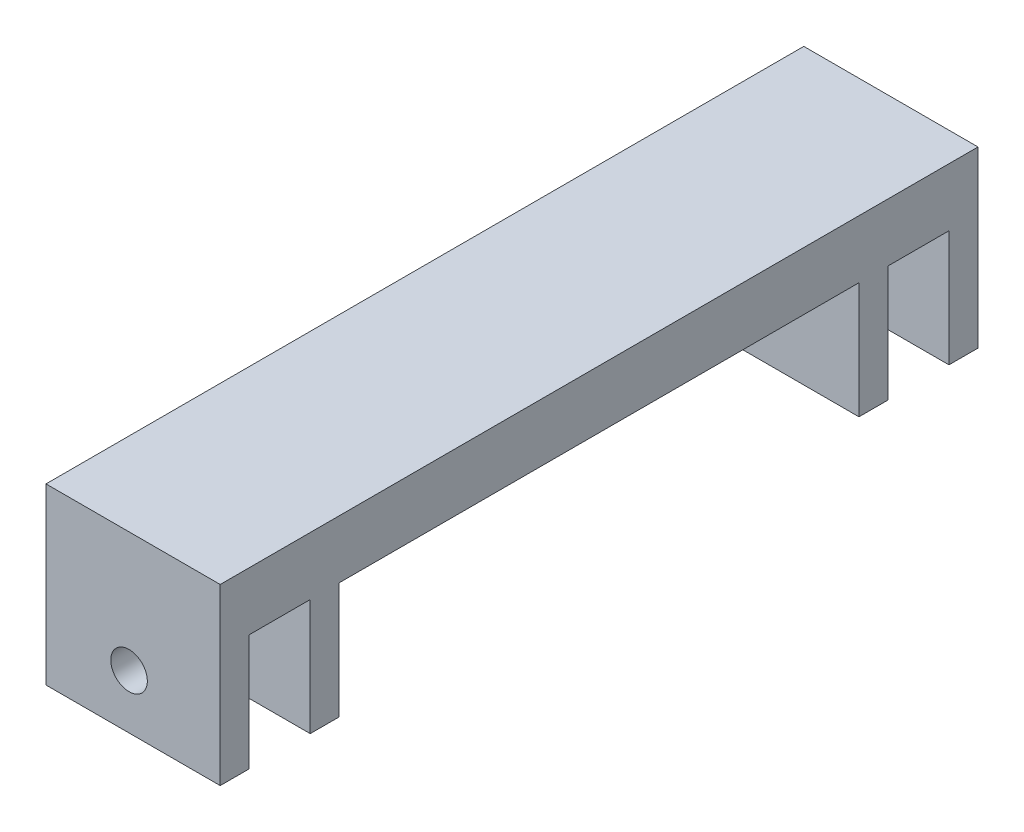
ISO-10303-21;
HEADER;
FILE_DESCRIPTION(('STEP AP214'),'2;1');
FILE_NAME('part.step','',(''),(''),'','','');
FILE_SCHEMA(('AUTOMOTIVE_DESIGN { 1 0 10303 214 1 1 1 1 }'));
ENDSEC;
DATA;
#1=APPLICATION_CONTEXT('core data for automotive mechanical design processes');
#2=APPLICATION_PROTOCOL_DEFINITION('international standard','automotive_design',2000,#1);
#3=PRODUCT_CONTEXT('',#1,'mechanical');
#4=PRODUCT('Part','Part','',(#3));
#5=PRODUCT_RELATED_PRODUCT_CATEGORY('part','',(#4));
#6=PRODUCT_DEFINITION_FORMATION('','',#4);
#7=PRODUCT_DEFINITION_CONTEXT('part definition',#1,'design');
#8=PRODUCT_DEFINITION('design','',#6,#7);
#9=PRODUCT_DEFINITION_SHAPE('','',#8);
#10=(LENGTH_UNIT() NAMED_UNIT(*) SI_UNIT(.MILLI.,.METRE.));
#11=(NAMED_UNIT(*) PLANE_ANGLE_UNIT() SI_UNIT($,.RADIAN.));
#12=(NAMED_UNIT(*) SI_UNIT($,.STERADIAN.) SOLID_ANGLE_UNIT());
#13=UNCERTAINTY_MEASURE_WITH_UNIT(LENGTH_MEASURE(1.E-05),#10,'distance_accuracy_value','');
#14=(GEOMETRIC_REPRESENTATION_CONTEXT(3) GLOBAL_UNCERTAINTY_ASSIGNED_CONTEXT((#13)) GLOBAL_UNIT_ASSIGNED_CONTEXT((#10,
#11,#12)) REPRESENTATION_CONTEXT('',''));
#15=CARTESIAN_POINT('',(0.,0.,0.));
#16=DIRECTION('',(0.,0.,1.));
#17=DIRECTION('',(1.,0.,0.));
#18=AXIS2_PLACEMENT_3D('',#15,#16,#17);
#19=CARTESIAN_POINT('',(0.,0.,130.5));
#20=DIRECTION('',(0.,1.,0.));
#21=DIRECTION('',(0.,0.,1.));
#22=AXIS2_PLACEMENT_3D('',#19,#20,#21);
#23=PLANE('',#22);
#24=DIRECTION('',(-1.,0.,0.));
#25=VECTOR('',#24,1.);
#26=CARTESIAN_POINT('',(30.,0.,115.));
#27=LINE('',#26,#25);
#28=CARTESIAN_POINT('',(30.,0.,115.));
#29=VERTEX_POINT('',#28);
#30=CARTESIAN_POINT('',(0.,0.,115.));
#31=VERTEX_POINT('',#30);
#32=EDGE_CURVE('E297',#29,#31,#27,.T.);
#33=ORIENTED_EDGE('',*,*,#32,.F.);
#34=DIRECTION('',(0.,0.,-1.));
#35=VECTOR('',#34,1.);
#36=CARTESIAN_POINT('',(30.,0.,130.5));
#37=LINE('',#36,#35);
#38=CARTESIAN_POINT('',(30.,0.,125.5));
#39=VERTEX_POINT('',#38);
#40=EDGE_CURVE('E172',#39,#29,#37,.T.);
#41=ORIENTED_EDGE('',*,*,#40,.F.);
#42=DIRECTION('',(1.,0.,0.));
#43=VECTOR('',#42,1.);
#44=CARTESIAN_POINT('',(0.,0.,125.5));
#45=LINE('',#44,#43);
#46=CARTESIAN_POINT('',(0.,0.,125.5));
#47=VERTEX_POINT('',#46);
#48=EDGE_CURVE('E173',#47,#39,#45,.T.);
#49=ORIENTED_EDGE('',*,*,#48,.F.);
#50=DIRECTION('',(0.,0.,-1.));
#51=VECTOR('',#50,1.);
#52=CARTESIAN_POINT('',(0.,0.,130.5));
#53=LINE('',#52,#51);
#54=EDGE_CURVE('E11',#47,#31,#53,.T.);
#55=ORIENTED_EDGE('',*,*,#54,.T.);
#56=EDGE_LOOP('',(#33,#41,#49,#55));
#57=FACE_BOUND('',#56,.T.);
#58=ADVANCED_FACE('F35',(#57),#23,.F.);
#59=DIRECTION('',(1.,0.,0.));
#60=VECTOR('',#59,1.);
#61=CARTESIAN_POINT('',(30.,0.,110.));
#62=LINE('',#61,#60);
#63=CARTESIAN_POINT('',(0.,0.,110.));
#64=VERTEX_POINT('',#63);
#65=CARTESIAN_POINT('',(30.,0.,110.));
#66=VERTEX_POINT('',#65);
#67=EDGE_CURVE('E166',#64,#66,#62,.T.);
#68=ORIENTED_EDGE('',*,*,#67,.F.);
#69=CARTESIAN_POINT('',(0.,0.,20.5));
#70=VERTEX_POINT('',#69);
#71=EDGE_CURVE('E44',#64,#70,#53,.T.);
#72=ORIENTED_EDGE('',*,*,#71,.T.);
#73=DIRECTION('',(-1.,0.,0.));
#74=VECTOR('',#73,1.);
#75=CARTESIAN_POINT('',(30.,0.,20.5));
#76=LINE('',#75,#74);
#77=CARTESIAN_POINT('',(30.,0.,20.5));
#78=VERTEX_POINT('',#77);
#79=EDGE_CURVE('E195',#78,#70,#76,.T.);
#80=ORIENTED_EDGE('',*,*,#79,.F.);
#81=EDGE_CURVE('E256',#66,#78,#37,.T.);
#82=ORIENTED_EDGE('',*,*,#81,.F.);
#83=EDGE_LOOP('',(#68,#72,#80,#82));
#84=FACE_BOUND('',#83,.T.);
#85=ADVANCED_FACE('F314',(#84),#23,.F.);
#86=DIRECTION('',(1.,0.,0.));
#87=VECTOR('',#86,1.);
#88=CARTESIAN_POINT('',(30.,0.,15.5));
#89=LINE('',#88,#87);
#90=CARTESIAN_POINT('',(0.,0.,15.5));
#91=VERTEX_POINT('',#90);
#92=CARTESIAN_POINT('',(30.,0.,15.5));
#93=VERTEX_POINT('',#92);
#94=EDGE_CURVE('E200',#91,#93,#89,.T.);
#95=ORIENTED_EDGE('',*,*,#94,.F.);
#96=CARTESIAN_POINT('',(0.,0.,5.));
#97=VERTEX_POINT('',#96);
#98=EDGE_CURVE('E45',#91,#97,#53,.T.);
#99=ORIENTED_EDGE('',*,*,#98,.T.);
#100=DIRECTION('',(-1.,0.,0.));
#101=VECTOR('',#100,1.);
#102=CARTESIAN_POINT('',(0.,0.,5.));
#103=LINE('',#102,#101);
#104=CARTESIAN_POINT('',(30.,0.,5.));
#105=VERTEX_POINT('',#104);
#106=EDGE_CURVE('E218',#105,#97,#103,.T.);
#107=ORIENTED_EDGE('',*,*,#106,.F.);
#108=EDGE_CURVE('E255',#93,#105,#37,.T.);
#109=ORIENTED_EDGE('',*,*,#108,.F.);
#110=EDGE_LOOP('',(#95,#99,#107,#109));
#111=FACE_BOUND('',#110,.T.);
#112=ADVANCED_FACE('F264',(#111),#23,.F.);
#113=CARTESIAN_POINT('',(0.,0.,130.5));
#114=DIRECTION('',(1.,0.,0.));
#115=DIRECTION('',(0.,0.,-1.));
#116=AXIS2_PLACEMENT_3D('',#113,#114,#115);
#117=PLANE('',#116);
#118=DIRECTION('',(0.,-1.,0.));
#119=VECTOR('',#118,1.);
#120=CARTESIAN_POINT('',(0.,0.,0.));
#121=LINE('',#120,#119);
#122=CARTESIAN_POINT('',(0.,10.,0.));
#123=VERTEX_POINT('',#122);
#124=CARTESIAN_POINT('',(0.,-20.,0.));
#125=VERTEX_POINT('',#124);
#126=EDGE_CURVE('E237',#123,#125,#121,.T.);
#127=ORIENTED_EDGE('',*,*,#126,.T.);
#128=DIRECTION('',(0.,0.,-1.));
#129=VECTOR('',#128,1.);
#130=CARTESIAN_POINT('',(0.,-20.,0.));
#131=LINE('',#130,#129);
#132=CARTESIAN_POINT('',(0.,-20.,5.));
#133=VERTEX_POINT('',#132);
#134=EDGE_CURVE('E219',#133,#125,#131,.T.);
#135=ORIENTED_EDGE('',*,*,#134,.F.);
#136=DIRECTION('',(0.,1.,0.));
#137=VECTOR('',#136,1.);
#138=CARTESIAN_POINT('',(0.,-20.,5.));
#139=LINE('',#138,#137);
#140=EDGE_CURVE('E229',#133,#97,#139,.T.);
#141=ORIENTED_EDGE('',*,*,#140,.T.);
#142=ORIENTED_EDGE('',*,*,#98,.F.);
#143=DIRECTION('',(0.,1.,0.));
#144=VECTOR('',#143,1.);
#145=CARTESIAN_POINT('',(0.,-20.,15.5));
#146=LINE('',#145,#144);
#147=CARTESIAN_POINT('',(0.,-20.,15.5));
#148=VERTEX_POINT('',#147);
#149=EDGE_CURVE('E210',#148,#91,#146,.T.);
#150=ORIENTED_EDGE('',*,*,#149,.F.);
#151=DIRECTION('',(0.,0.,-1.));
#152=VECTOR('',#151,1.);
#153=CARTESIAN_POINT('',(0.,-20.,15.5));
#154=LINE('',#153,#152);
#155=CARTESIAN_POINT('',(0.,-20.,20.5));
#156=VERTEX_POINT('',#155);
#157=EDGE_CURVE('E202',#156,#148,#154,.T.);
#158=ORIENTED_EDGE('',*,*,#157,.F.);
#159=DIRECTION('',(0.,1.,0.));
#160=VECTOR('',#159,1.);
#161=CARTESIAN_POINT('',(0.,-20.,20.5));
#162=LINE('',#161,#160);
#163=EDGE_CURVE('E212',#156,#70,#162,.T.);
#164=ORIENTED_EDGE('',*,*,#163,.T.);
#165=ORIENTED_EDGE('',*,*,#71,.F.);
#166=DIRECTION('',(0.,1.,0.));
#167=VECTOR('',#166,1.);
#168=CARTESIAN_POINT('',(0.,-20.,110.));
#169=LINE('',#168,#167);
#170=CARTESIAN_POINT('',(0.,-20.,110.));
#171=VERTEX_POINT('',#170);
#172=EDGE_CURVE('E177',#171,#64,#169,.T.);
#173=ORIENTED_EDGE('',*,*,#172,.F.);
#174=DIRECTION('',(0.,0.,-1.));
#175=VECTOR('',#174,1.);
#176=CARTESIAN_POINT('',(0.,-20.,115.));
#177=LINE('',#176,#175);
#178=CARTESIAN_POINT('',(0.,-20.,115.));
#179=VERTEX_POINT('',#178);
#180=EDGE_CURVE('E160',#179,#171,#177,.T.);
#181=ORIENTED_EDGE('',*,*,#180,.F.);
#182=DIRECTION('',(0.,1.,0.));
#183=VECTOR('',#182,1.);
#184=CARTESIAN_POINT('',(0.,-20.,115.));
#185=LINE('',#184,#183);
#186=EDGE_CURVE('E157',#179,#31,#185,.T.);
#187=ORIENTED_EDGE('',*,*,#186,.T.);
#188=ORIENTED_EDGE('',*,*,#54,.F.);
#189=DIRECTION('',(0.,1.,0.));
#190=VECTOR('',#189,1.);
#191=CARTESIAN_POINT('',(0.,-20.,125.5));
#192=LINE('',#191,#190);
#193=CARTESIAN_POINT('',(0.,-20.,125.5));
#194=VERTEX_POINT('',#193);
#195=EDGE_CURVE('E193',#194,#47,#192,.T.);
#196=ORIENTED_EDGE('',*,*,#195,.F.);
#197=DIRECTION('',(0.,0.,-1.));
#198=VECTOR('',#197,1.);
#199=CARTESIAN_POINT('',(0.,-20.,130.5));
#200=LINE('',#199,#198);
#201=CARTESIAN_POINT('',(0.,-20.,130.5));
#202=VERTEX_POINT('',#201);
#203=EDGE_CURVE('E175',#202,#194,#200,.T.);
#204=ORIENTED_EDGE('',*,*,#203,.F.);
#205=DIRECTION('',(0.,-1.,0.));
#206=VECTOR('',#205,1.);
#207=CARTESIAN_POINT('',(0.,0.,130.5));
#208=LINE('',#207,#206);
#209=CARTESIAN_POINT('',(0.,10.,130.5));
#210=VERTEX_POINT('',#209);
#211=EDGE_CURVE('E238',#210,#202,#208,.T.);
#212=ORIENTED_EDGE('',*,*,#211,.F.);
#213=DIRECTION('',(0.,0.,-1.));
#214=VECTOR('',#213,1.);
#215=CARTESIAN_POINT('',(0.,10.,130.5));
#216=LINE('',#215,#214);
#217=EDGE_CURVE('E245',#210,#123,#216,.T.);
#218=ORIENTED_EDGE('',*,*,#217,.T.);
#219=EDGE_LOOP('',(#127,#135,#141,#142,#150,#158,#164,#165,#173,#181,#187,#188,#196,#204,#212,#218));
#220=FACE_BOUND('',#219,.T.);
#221=ADVANCED_FACE('F37',(#220),#117,.F.);
#222=CARTESIAN_POINT('',(30.,0.,130.5));
#223=DIRECTION('',(-1.,0.,0.));
#224=DIRECTION('',(0.,0.,1.));
#225=AXIS2_PLACEMENT_3D('',#222,#223,#224);
#226=PLANE('',#225);
#227=DIRECTION('',(0.,1.,0.));
#228=VECTOR('',#227,1.);
#229=CARTESIAN_POINT('',(30.,0.,0.));
#230=LINE('',#229,#228);
#231=CARTESIAN_POINT('',(30.,-20.,0.));
#232=VERTEX_POINT('',#231);
#233=CARTESIAN_POINT('',(30.,10.,0.));
#234=VERTEX_POINT('',#233);
#235=EDGE_CURVE('E247',#232,#234,#230,.T.);
#236=ORIENTED_EDGE('',*,*,#235,.T.);
#237=DIRECTION('',(0.,0.,-1.));
#238=VECTOR('',#237,1.);
#239=CARTESIAN_POINT('',(30.,10.,130.5));
#240=LINE('',#239,#238);
#241=CARTESIAN_POINT('',(30.,10.,130.5));
#242=VERTEX_POINT('',#241);
#243=EDGE_CURVE('E252',#242,#234,#240,.T.);
#244=ORIENTED_EDGE('',*,*,#243,.F.);
#245=DIRECTION('',(0.,1.,0.));
#246=VECTOR('',#245,1.);
#247=CARTESIAN_POINT('',(30.,0.,130.5));
#248=LINE('',#247,#246);
#249=CARTESIAN_POINT('',(30.,-20.,130.5));
#250=VERTEX_POINT('',#249);
#251=EDGE_CURVE('E240',#250,#242,#248,.T.);
#252=ORIENTED_EDGE('',*,*,#251,.F.);
#253=DIRECTION('',(0.,0.,1.));
#254=VECTOR('',#253,1.);
#255=CARTESIAN_POINT('',(30.,-20.,130.5));
#256=LINE('',#255,#254);
#257=CARTESIAN_POINT('',(30.,-20.,125.5));
#258=VERTEX_POINT('',#257);
#259=EDGE_CURVE('E185',#258,#250,#256,.T.);
#260=ORIENTED_EDGE('',*,*,#259,.F.);
#261=DIRECTION('',(0.,1.,0.));
#262=VECTOR('',#261,1.);
#263=CARTESIAN_POINT('',(30.,-20.,125.5));
#264=LINE('',#263,#262);
#265=EDGE_CURVE('E190',#258,#39,#264,.T.);
#266=ORIENTED_EDGE('',*,*,#265,.T.);
#267=ORIENTED_EDGE('',*,*,#40,.T.);
#268=DIRECTION('',(0.,1.,0.));
#269=VECTOR('',#268,1.);
#270=CARTESIAN_POINT('',(30.,-20.,115.));
#271=LINE('',#270,#269);
#272=CARTESIAN_POINT('',(30.,-20.,115.));
#273=VERTEX_POINT('',#272);
#274=EDGE_CURVE('E154',#273,#29,#271,.T.);
#275=ORIENTED_EDGE('',*,*,#274,.F.);
#276=DIRECTION('',(0.,0.,1.));
#277=VECTOR('',#276,1.);
#278=CARTESIAN_POINT('',(30.,-20.,115.));
#279=LINE('',#278,#277);
#280=CARTESIAN_POINT('',(30.,-20.,110.));
#281=VERTEX_POINT('',#280);
#282=EDGE_CURVE('E161',#281,#273,#279,.T.);
#283=ORIENTED_EDGE('',*,*,#282,.F.);
#284=DIRECTION('',(0.,1.,0.));
#285=VECTOR('',#284,1.);
#286=CARTESIAN_POINT('',(30.,-20.,110.));
#287=LINE('',#286,#285);
#288=EDGE_CURVE('E52',#281,#66,#287,.T.);
#289=ORIENTED_EDGE('',*,*,#288,.T.);
#290=ORIENTED_EDGE('',*,*,#81,.T.);
#291=DIRECTION('',(0.,1.,0.));
#292=VECTOR('',#291,1.);
#293=CARTESIAN_POINT('',(30.,-20.,20.5));
#294=LINE('',#293,#292);
#295=CARTESIAN_POINT('',(30.,-20.,20.5));
#296=VERTEX_POINT('',#295);
#297=EDGE_CURVE('E215',#296,#78,#294,.T.);
#298=ORIENTED_EDGE('',*,*,#297,.F.);
#299=DIRECTION('',(0.,0.,1.));
#300=VECTOR('',#299,1.);
#301=CARTESIAN_POINT('',(30.,-20.,15.5));
#302=LINE('',#301,#300);
#303=CARTESIAN_POINT('',(30.,-20.,15.5));
#304=VERTEX_POINT('',#303);
#305=EDGE_CURVE('E196',#304,#296,#302,.T.);
#306=ORIENTED_EDGE('',*,*,#305,.F.);
#307=DIRECTION('',(0.,1.,0.));
#308=VECTOR('',#307,1.);
#309=CARTESIAN_POINT('',(30.,-20.,15.5));
#310=LINE('',#309,#308);
#311=EDGE_CURVE('E59',#304,#93,#310,.T.);
#312=ORIENTED_EDGE('',*,*,#311,.T.);
#313=ORIENTED_EDGE('',*,*,#108,.T.);
#314=DIRECTION('',(0.,1.,0.));
#315=VECTOR('',#314,1.);
#316=CARTESIAN_POINT('',(30.,-20.,5.));
#317=LINE('',#316,#315);
#318=CARTESIAN_POINT('',(30.,-20.,5.));
#319=VERTEX_POINT('',#318);
#320=EDGE_CURVE('E234',#319,#105,#317,.T.);
#321=ORIENTED_EDGE('',*,*,#320,.F.);
#322=DIRECTION('',(0.,0.,1.));
#323=VECTOR('',#322,1.);
#324=CARTESIAN_POINT('',(30.,-20.,0.));
#325=LINE('',#324,#323);
#326=EDGE_CURVE('E225',#232,#319,#325,.T.);
#327=ORIENTED_EDGE('',*,*,#326,.F.);
#328=EDGE_LOOP('',(#236,#244,#252,#260,#266,#267,#275,#283,#289,#290,#298,#306,#312,#313,#321,#327));
#329=FACE_BOUND('',#328,.T.);
#330=ADVANCED_FACE('F169',(#329),#226,.F.);
#331=CARTESIAN_POINT('',(0.,10.,130.5));
#332=DIRECTION('',(0.,-1.,0.));
#333=DIRECTION('',(0.,0.,-1.));
#334=AXIS2_PLACEMENT_3D('',#331,#332,#333);
#335=PLANE('',#334);
#336=DIRECTION('',(-1.,0.,0.));
#337=VECTOR('',#336,1.);
#338=CARTESIAN_POINT('',(0.,10.,0.));
#339=LINE('',#338,#337);
#340=EDGE_CURVE('E241',#234,#123,#339,.T.);
#341=ORIENTED_EDGE('',*,*,#340,.T.);
#342=ORIENTED_EDGE('',*,*,#217,.F.);
#343=DIRECTION('',(-1.,0.,0.));
#344=VECTOR('',#343,1.);
#345=CARTESIAN_POINT('',(0.,10.,130.5));
#346=LINE('',#345,#344);
#347=EDGE_CURVE('E243',#242,#210,#346,.T.);
#348=ORIENTED_EDGE('',*,*,#347,.F.);
#349=ORIENTED_EDGE('',*,*,#243,.T.);
#350=EDGE_LOOP('',(#341,#342,#348,#349));
#351=FACE_BOUND('',#350,.T.);
#352=ADVANCED_FACE('F278',(#351),#335,.F.);
#353=CARTESIAN_POINT('',(0.,0.,130.5));
#354=DIRECTION('',(0.,0.,-1.));
#355=DIRECTION('',(-1.,0.,0.));
#356=AXIS2_PLACEMENT_3D('',#353,#354,#355);
#357=PLANE('',#356);
#358=CARTESIAN_POINT('',(14.3021431152746,-10.6869098112044,130.5));
#359=DIRECTION('',(0.,0.,1.));
#360=DIRECTION('',(1.,0.,0.));
#361=AXIS2_PLACEMENT_3D('',#358,#359,#360);
#362=CIRCLE('',#361,3.15);
#363=CARTESIAN_POINT('',(17.4521431152746,-10.6869098112044,130.5));
#364=VERTEX_POINT('',#363);
#365=EDGE_CURVE('E549',#364,#364,#362,.T.);
#366=ORIENTED_EDGE('',*,*,#365,.F.);
#367=EDGE_LOOP('',(#366));
#368=FACE_BOUND('',#367,.T.);
#369=ORIENTED_EDGE('',*,*,#211,.T.);
#370=DIRECTION('',(-1.,0.,0.));
#371=VECTOR('',#370,1.);
#372=CARTESIAN_POINT('',(0.,-20.,130.5));
#373=LINE('',#372,#371);
#374=EDGE_CURVE('E188',#250,#202,#373,.T.);
#375=ORIENTED_EDGE('',*,*,#374,.F.);
#376=ORIENTED_EDGE('',*,*,#251,.T.);
#377=ORIENTED_EDGE('',*,*,#347,.T.);
#378=EDGE_LOOP('',(#369,#375,#376,#377));
#379=FACE_BOUND('',#378,.T.);
#380=ADVANCED_FACE('F288',(#368,#379),#357,.F.);
#381=CARTESIAN_POINT('',(0.,0.,0.));
#382=DIRECTION('',(0.,0.,-1.));
#383=DIRECTION('',(-1.,0.,0.));
#384=AXIS2_PLACEMENT_3D('',#381,#382,#383);
#385=PLANE('',#384);
#386=CARTESIAN_POINT('',(14.3021431152746,-10.6869098112044,0.));
#387=DIRECTION('',(0.,0.,1.));
#388=DIRECTION('',(1.,0.,0.));
#389=AXIS2_PLACEMENT_3D('',#386,#387,#388);
#390=CIRCLE('',#389,3.15);
#391=CARTESIAN_POINT('',(17.4521431152746,-10.6869098112044,0.));
#392=VERTEX_POINT('',#391);
#393=EDGE_CURVE('E547',#392,#392,#390,.T.);
#394=ORIENTED_EDGE('',*,*,#393,.T.);
#395=EDGE_LOOP('',(#394));
#396=FACE_BOUND('',#395,.T.);
#397=ORIENTED_EDGE('',*,*,#126,.F.);
#398=ORIENTED_EDGE('',*,*,#340,.F.);
#399=ORIENTED_EDGE('',*,*,#235,.F.);
#400=DIRECTION('',(1.,0.,0.));
#401=VECTOR('',#400,1.);
#402=CARTESIAN_POINT('',(0.,-20.,0.));
#403=LINE('',#402,#401);
#404=EDGE_CURVE('E222',#125,#232,#403,.T.);
#405=ORIENTED_EDGE('',*,*,#404,.F.);
#406=EDGE_LOOP('',(#397,#398,#399,#405));
#407=FACE_BOUND('',#406,.T.);
#408=ADVANCED_FACE('F281',(#396,#407),#385,.T.);
#409=CARTESIAN_POINT('',(0.,-20.,5.));
#410=DIRECTION('',(0.,0.,-1.));
#411=DIRECTION('',(-1.,0.,0.));
#412=AXIS2_PLACEMENT_3D('',#409,#410,#411);
#413=PLANE('',#412);
#414=CARTESIAN_POINT('',(14.3021431152746,-10.6869098112044,5.));
#415=DIRECTION('',(0.,0.,-1.));
#416=DIRECTION('',(-1.,0.,0.));
#417=AXIS2_PLACEMENT_3D('',#414,#415,#416);
#418=CIRCLE('',#417,3.15);
#419=CARTESIAN_POINT('',(11.1521431152746,-10.6869098112044,5.));
#420=VERTEX_POINT('',#419);
#421=EDGE_CURVE('E298',#420,#420,#418,.T.);
#422=ORIENTED_EDGE('',*,*,#421,.T.);
#423=EDGE_LOOP('',(#422));
#424=FACE_BOUND('',#423,.T.);
#425=ORIENTED_EDGE('',*,*,#106,.T.);
#426=ORIENTED_EDGE('',*,*,#140,.F.);
#427=DIRECTION('',(-1.,0.,0.));
#428=VECTOR('',#427,1.);
#429=CARTESIAN_POINT('',(0.,-20.,5.));
#430=LINE('',#429,#428);
#431=EDGE_CURVE('E227',#319,#133,#430,.T.);
#432=ORIENTED_EDGE('',*,*,#431,.F.);
#433=ORIENTED_EDGE('',*,*,#320,.T.);
#434=EDGE_LOOP('',(#425,#426,#432,#433));
#435=FACE_BOUND('',#434,.T.);
#436=ADVANCED_FACE('F268',(#424,#435),#413,.F.);
#437=CARTESIAN_POINT('',(0.,-20.,0.));
#438=DIRECTION('',(0.,1.,0.));
#439=DIRECTION('',(0.,0.,1.));
#440=AXIS2_PLACEMENT_3D('',#437,#438,#439);
#441=PLANE('',#440);
#442=ORIENTED_EDGE('',*,*,#134,.T.);
#443=ORIENTED_EDGE('',*,*,#404,.T.);
#444=ORIENTED_EDGE('',*,*,#326,.T.);
#445=ORIENTED_EDGE('',*,*,#431,.T.);
#446=EDGE_LOOP('',(#442,#443,#444,#445));
#447=FACE_BOUND('',#446,.T.);
#448=ADVANCED_FACE('F271',(#447),#441,.F.);
#449=CARTESIAN_POINT('',(30.,-20.,20.5));
#450=DIRECTION('',(0.,0.,-1.));
#451=DIRECTION('',(-1.,0.,0.));
#452=AXIS2_PLACEMENT_3D('',#449,#450,#451);
#453=PLANE('',#452);
#454=CARTESIAN_POINT('',(14.3021431152746,-10.6869098112044,20.5));
#455=DIRECTION('',(0.,0.,-1.));
#456=DIRECTION('',(-1.,0.,0.));
#457=AXIS2_PLACEMENT_3D('',#454,#455,#456);
#458=CIRCLE('',#457,3.15);
#459=CARTESIAN_POINT('',(11.1521431152746,-10.6869098112044,20.5));
#460=VERTEX_POINT('',#459);
#461=EDGE_CURVE('E302',#460,#460,#458,.T.);
#462=ORIENTED_EDGE('',*,*,#461,.T.);
#463=EDGE_LOOP('',(#462));
#464=FACE_BOUND('',#463,.T.);
#465=ORIENTED_EDGE('',*,*,#79,.T.);
#466=ORIENTED_EDGE('',*,*,#163,.F.);
#467=DIRECTION('',(-1.,0.,0.));
#468=VECTOR('',#467,1.);
#469=CARTESIAN_POINT('',(30.,-20.,20.5));
#470=LINE('',#469,#468);
#471=EDGE_CURVE('E199',#296,#156,#470,.T.);
#472=ORIENTED_EDGE('',*,*,#471,.F.);
#473=ORIENTED_EDGE('',*,*,#297,.T.);
#474=EDGE_LOOP('',(#465,#466,#472,#473));
#475=FACE_BOUND('',#474,.T.);
#476=ADVANCED_FACE('F320',(#464,#475),#453,.F.);
#477=CARTESIAN_POINT('',(30.,-20.,15.5));
#478=DIRECTION('',(0.,0.,1.));
#479=DIRECTION('',(1.,0.,0.));
#480=AXIS2_PLACEMENT_3D('',#477,#478,#479);
#481=PLANE('',#480);
#482=CARTESIAN_POINT('',(14.3021431152746,-10.6869098112044,15.5));
#483=DIRECTION('',(0.,0.,1.));
#484=DIRECTION('',(1.,0.,0.));
#485=AXIS2_PLACEMENT_3D('',#482,#483,#484);
#486=CIRCLE('',#485,3.15);
#487=CARTESIAN_POINT('',(17.4521431152746,-10.6869098112044,15.5));
#488=VERTEX_POINT('',#487);
#489=EDGE_CURVE('E561',#488,#488,#486,.T.);
#490=ORIENTED_EDGE('',*,*,#489,.T.);
#491=EDGE_LOOP('',(#490));
#492=FACE_BOUND('',#491,.T.);
#493=ORIENTED_EDGE('',*,*,#94,.T.);
#494=ORIENTED_EDGE('',*,*,#311,.F.);
#495=DIRECTION('',(1.,0.,0.));
#496=VECTOR('',#495,1.);
#497=CARTESIAN_POINT('',(30.,-20.,15.5));
#498=LINE('',#497,#496);
#499=EDGE_CURVE('E204',#148,#304,#498,.T.);
#500=ORIENTED_EDGE('',*,*,#499,.F.);
#501=ORIENTED_EDGE('',*,*,#149,.T.);
#502=EDGE_LOOP('',(#493,#494,#500,#501));
#503=FACE_BOUND('',#502,.T.);
#504=ADVANCED_FACE('F326',(#492,#503),#481,.F.);
#505=CARTESIAN_POINT('',(0.,-20.,0.));
#506=DIRECTION('',(0.,-1.,0.));
#507=DIRECTION('',(0.,0.,-1.));
#508=AXIS2_PLACEMENT_3D('',#505,#506,#507);
#509=PLANE('',#508);
#510=ORIENTED_EDGE('',*,*,#305,.T.);
#511=ORIENTED_EDGE('',*,*,#471,.T.);
#512=ORIENTED_EDGE('',*,*,#157,.T.);
#513=ORIENTED_EDGE('',*,*,#499,.T.);
#514=EDGE_LOOP('',(#510,#511,#512,#513));
#515=FACE_BOUND('',#514,.T.);
#516=ADVANCED_FACE('F323',(#515),#509,.T.);
#517=CARTESIAN_POINT('',(0.,-20.,125.5));
#518=DIRECTION('',(0.,0.,1.));
#519=DIRECTION('',(1.,0.,0.));
#520=AXIS2_PLACEMENT_3D('',#517,#518,#519);
#521=PLANE('',#520);
#522=CARTESIAN_POINT('',(14.3021431152746,-10.6869098112044,125.5));
#523=DIRECTION('',(0.,0.,1.));
#524=DIRECTION('',(1.,0.,0.));
#525=AXIS2_PLACEMENT_3D('',#522,#523,#524);
#526=CIRCLE('',#525,3.15);
#527=CARTESIAN_POINT('',(17.4521431152746,-10.6869098112044,125.5));
#528=VERTEX_POINT('',#527);
#529=EDGE_CURVE('E558',#528,#528,#526,.T.);
#530=ORIENTED_EDGE('',*,*,#529,.T.);
#531=EDGE_LOOP('',(#530));
#532=FACE_BOUND('',#531,.T.);
#533=ORIENTED_EDGE('',*,*,#48,.T.);
#534=ORIENTED_EDGE('',*,*,#265,.F.);
#535=DIRECTION('',(1.,0.,0.));
#536=VECTOR('',#535,1.);
#537=CARTESIAN_POINT('',(0.,-20.,125.5));
#538=LINE('',#537,#536);
#539=EDGE_CURVE('E183',#194,#258,#538,.T.);
#540=ORIENTED_EDGE('',*,*,#539,.F.);
#541=ORIENTED_EDGE('',*,*,#195,.T.);
#542=EDGE_LOOP('',(#533,#534,#540,#541));
#543=FACE_BOUND('',#542,.T.);
#544=ADVANCED_FACE('F334',(#532,#543),#521,.F.);
#545=CARTESIAN_POINT('',(0.,-20.,0.));
#546=DIRECTION('',(0.,-1.,0.));
#547=DIRECTION('',(0.,0.,-1.));
#548=AXIS2_PLACEMENT_3D('',#545,#546,#547);
#549=PLANE('',#548);
#550=ORIENTED_EDGE('',*,*,#203,.T.);
#551=ORIENTED_EDGE('',*,*,#539,.T.);
#552=ORIENTED_EDGE('',*,*,#259,.T.);
#553=ORIENTED_EDGE('',*,*,#374,.T.);
#554=EDGE_LOOP('',(#550,#551,#552,#553));
#555=FACE_BOUND('',#554,.T.);
#556=ADVANCED_FACE('F290',(#555),#549,.T.);
#557=CARTESIAN_POINT('',(30.,-20.,115.));
#558=DIRECTION('',(0.,0.,-1.));
#559=DIRECTION('',(-1.,0.,0.));
#560=AXIS2_PLACEMENT_3D('',#557,#558,#559);
#561=PLANE('',#560);
#562=CARTESIAN_POINT('',(14.3021431152746,-10.6869098112044,115.));
#563=DIRECTION('',(0.,0.,-1.));
#564=DIRECTION('',(-1.,0.,0.));
#565=AXIS2_PLACEMENT_3D('',#562,#563,#564);
#566=CIRCLE('',#565,3.15);
#567=CARTESIAN_POINT('',(11.1521431152746,-10.6869098112044,115.));
#568=VERTEX_POINT('',#567);
#569=EDGE_CURVE('E552',#568,#568,#566,.T.);
#570=ORIENTED_EDGE('',*,*,#569,.T.);
#571=EDGE_LOOP('',(#570));
#572=FACE_BOUND('',#571,.T.);
#573=ORIENTED_EDGE('',*,*,#32,.T.);
#574=ORIENTED_EDGE('',*,*,#186,.F.);
#575=DIRECTION('',(-1.,0.,0.));
#576=VECTOR('',#575,1.);
#577=CARTESIAN_POINT('',(30.,-20.,115.));
#578=LINE('',#577,#576);
#579=EDGE_CURVE('E150',#273,#179,#578,.T.);
#580=ORIENTED_EDGE('',*,*,#579,.F.);
#581=ORIENTED_EDGE('',*,*,#274,.T.);
#582=EDGE_LOOP('',(#573,#574,#580,#581));
#583=FACE_BOUND('',#582,.T.);
#584=ADVANCED_FACE('F152',(#572,#583),#561,.F.);
#585=CARTESIAN_POINT('',(30.,-20.,110.));
#586=DIRECTION('',(0.,0.,1.));
#587=DIRECTION('',(1.,0.,0.));
#588=AXIS2_PLACEMENT_3D('',#585,#586,#587);
#589=PLANE('',#588);
#590=CARTESIAN_POINT('',(14.3021431152746,-10.6869098112044,110.));
#591=DIRECTION('',(0.,0.,1.));
#592=DIRECTION('',(1.,0.,0.));
#593=AXIS2_PLACEMENT_3D('',#590,#591,#592);
#594=CIRCLE('',#593,3.15);
#595=CARTESIAN_POINT('',(17.4521431152746,-10.6869098112044,110.));
#596=VERTEX_POINT('',#595);
#597=EDGE_CURVE('E39',#596,#596,#594,.T.);
#598=ORIENTED_EDGE('',*,*,#597,.T.);
#599=EDGE_LOOP('',(#598));
#600=FACE_BOUND('',#599,.T.);
#601=ORIENTED_EDGE('',*,*,#67,.T.);
#602=ORIENTED_EDGE('',*,*,#288,.F.);
#603=DIRECTION('',(1.,0.,0.));
#604=VECTOR('',#603,1.);
#605=CARTESIAN_POINT('',(30.,-20.,110.));
#606=LINE('',#605,#604);
#607=EDGE_CURVE('E165',#171,#281,#606,.T.);
#608=ORIENTED_EDGE('',*,*,#607,.F.);
#609=ORIENTED_EDGE('',*,*,#172,.T.);
#610=EDGE_LOOP('',(#601,#602,#608,#609));
#611=FACE_BOUND('',#610,.T.);
#612=ADVANCED_FACE('F310',(#600,#611),#589,.F.);
#613=CARTESIAN_POINT('',(0.,-20.,0.));
#614=DIRECTION('',(0.,1.,0.));
#615=DIRECTION('',(0.,0.,1.));
#616=AXIS2_PLACEMENT_3D('',#613,#614,#615);
#617=PLANE('',#616);
#618=ORIENTED_EDGE('',*,*,#282,.T.);
#619=ORIENTED_EDGE('',*,*,#579,.T.);
#620=ORIENTED_EDGE('',*,*,#180,.T.);
#621=ORIENTED_EDGE('',*,*,#607,.T.);
#622=EDGE_LOOP('',(#618,#619,#620,#621));
#623=FACE_BOUND('',#622,.T.);
#624=ADVANCED_FACE('F163',(#623),#617,.F.);
#625=CARTESIAN_POINT('',(14.3021431152746,-10.6869098112044,0.));
#626=DIRECTION('',(0.,0.,1.));
#627=DIRECTION('',(1.,0.,0.));
#628=AXIS2_PLACEMENT_3D('',#625,#626,#627);
#629=CYLINDRICAL_SURFACE('',#628,3.15);
#630=ORIENTED_EDGE('',*,*,#597,.F.);
#631=EDGE_LOOP('',(#630));
#632=FACE_BOUND('',#631,.T.);
#633=ORIENTED_EDGE('',*,*,#569,.F.);
#634=EDGE_LOOP('',(#633));
#635=FACE_BOUND('',#634,.T.);
#636=ADVANCED_FACE('F419',(#632,#635),#629,.F.);
#637=ORIENTED_EDGE('',*,*,#365,.T.);
#638=EDGE_LOOP('',(#637));
#639=FACE_BOUND('',#638,.T.);
#640=ORIENTED_EDGE('',*,*,#529,.F.);
#641=EDGE_LOOP('',(#640));
#642=FACE_BOUND('',#641,.T.);
#643=ADVANCED_FACE('F424',(#639,#642),#629,.F.);
#644=ORIENTED_EDGE('',*,*,#489,.F.);
#645=EDGE_LOOP('',(#644));
#646=FACE_BOUND('',#645,.T.);
#647=ORIENTED_EDGE('',*,*,#461,.F.);
#648=EDGE_LOOP('',(#647));
#649=FACE_BOUND('',#648,.T.);
#650=ADVANCED_FACE('F435',(#646,#649),#629,.F.);
#651=ORIENTED_EDGE('',*,*,#393,.F.);
#652=EDGE_LOOP('',(#651));
#653=FACE_BOUND('',#652,.T.);
#654=ORIENTED_EDGE('',*,*,#421,.F.);
#655=EDGE_LOOP('',(#654));
#656=FACE_BOUND('',#655,.T.);
#657=ADVANCED_FACE('F427',(#653,#656),#629,.F.);
#658=CLOSED_SHELL('',(#58,#85,#112,#221,#330,#352,#380,#408,#436,#448,#476,#504,#516,#544,#556,
#584,#612,#624,#636,#643,#650,#657));
#659=MANIFOLD_SOLID_BREP('B2',#658);
#660=ADVANCED_BREP_SHAPE_REPRESENTATION('',(#18,#659),#14);
#661=SHAPE_DEFINITION_REPRESENTATION(#9,#660);
ENDSEC;
END-ISO-10303-21;
